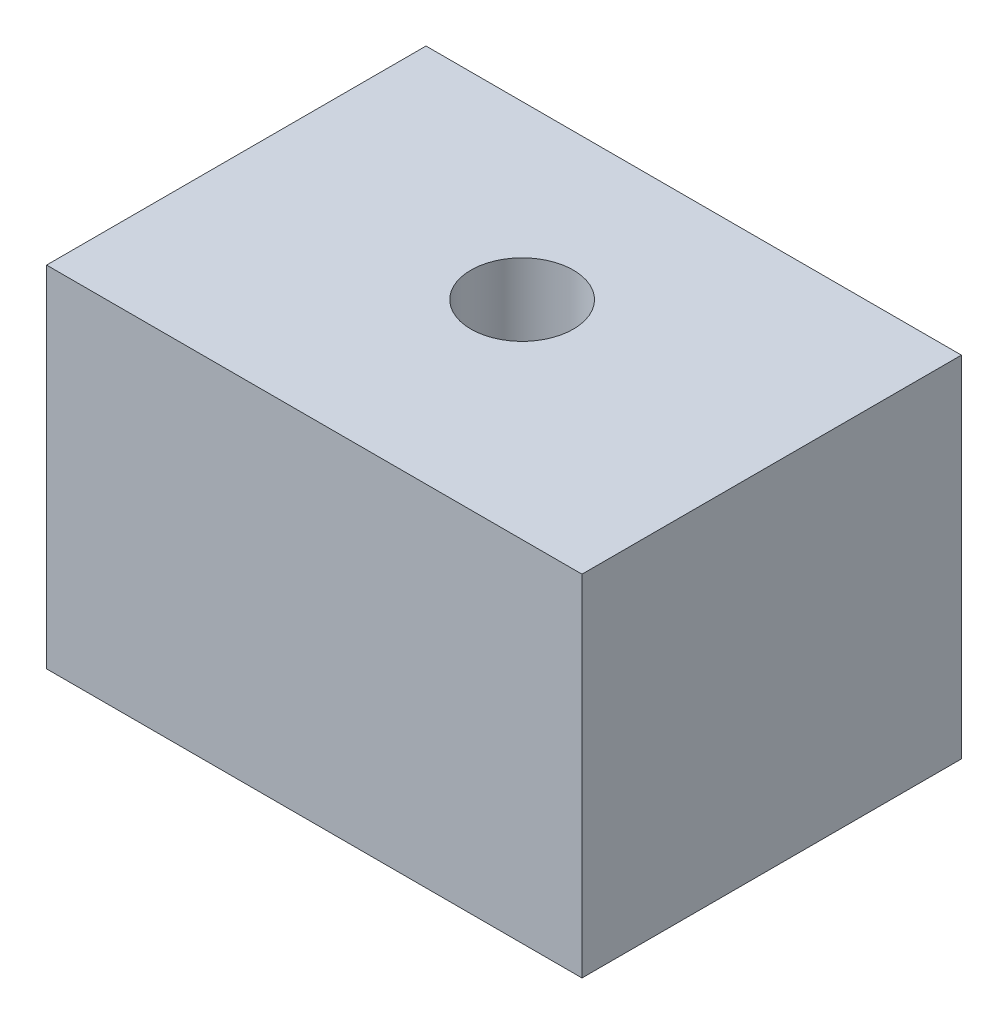
ISO-10303-21;
HEADER;
FILE_DESCRIPTION(('STEP AP214'),'2;1');
FILE_NAME('part.step','',(''),(''),'','','');
FILE_SCHEMA(('AUTOMOTIVE_DESIGN { 1 0 10303 214 1 1 1 1 }'));
ENDSEC;
DATA;
#1=APPLICATION_CONTEXT('core data for automotive mechanical design processes');
#2=APPLICATION_PROTOCOL_DEFINITION('international standard','automotive_design',2000,#1);
#3=PRODUCT_CONTEXT('',#1,'mechanical');
#4=PRODUCT('Part','Part','',(#3));
#5=PRODUCT_RELATED_PRODUCT_CATEGORY('part','',(#4));
#6=PRODUCT_DEFINITION_FORMATION('','',#4);
#7=PRODUCT_DEFINITION_CONTEXT('part definition',#1,'design');
#8=PRODUCT_DEFINITION('design','',#6,#7);
#9=PRODUCT_DEFINITION_SHAPE('','',#8);
#10=(LENGTH_UNIT() NAMED_UNIT(*) SI_UNIT(.MILLI.,.METRE.));
#11=(NAMED_UNIT(*) PLANE_ANGLE_UNIT() SI_UNIT($,.RADIAN.));
#12=(NAMED_UNIT(*) SI_UNIT($,.STERADIAN.) SOLID_ANGLE_UNIT());
#13=UNCERTAINTY_MEASURE_WITH_UNIT(LENGTH_MEASURE(1.E-05),#10,'distance_accuracy_value','');
#14=(GEOMETRIC_REPRESENTATION_CONTEXT(3) GLOBAL_UNCERTAINTY_ASSIGNED_CONTEXT((#13)) GLOBAL_UNIT_ASSIGNED_CONTEXT((#10,
#11,#12)) REPRESENTATION_CONTEXT('',''));
#15=CARTESIAN_POINT('',(0.,0.,0.));
#16=DIRECTION('',(0.,0.,1.));
#17=DIRECTION('',(1.,0.,0.));
#18=AXIS2_PLACEMENT_3D('',#15,#16,#17);
#19=CARTESIAN_POINT('',(35.2778331148973,23.0435502776513,50.));
#20=DIRECTION('',(-1.,0.,0.));
#21=DIRECTION('',(0.,0.,1.));
#22=AXIS2_PLACEMENT_3D('',#19,#20,#21);
#23=PLANE('',#22);
#24=DIRECTION('',(0.,1.,0.));
#25=VECTOR('',#24,1.);
#26=CARTESIAN_POINT('',(35.2778331148973,23.0435502776513,0.));
#27=LINE('',#26,#25);
#28=CARTESIAN_POINT('',(35.2778331148973,-23.0435502776513,0.));
#29=VERTEX_POINT('',#28);
#30=CARTESIAN_POINT('',(35.2778331148973,23.0435502776513,0.));
#31=VERTEX_POINT('',#30);
#32=EDGE_CURVE('E117',#29,#31,#27,.T.);
#33=ORIENTED_EDGE('',*,*,#32,.T.);
#34=DIRECTION('',(0.,0.,-1.));
#35=VECTOR('',#34,1.);
#36=CARTESIAN_POINT('',(35.2778331148973,23.0435502776513,50.));
#37=LINE('',#36,#35);
#38=CARTESIAN_POINT('',(35.2778331148973,23.0435502776513,50.));
#39=VERTEX_POINT('',#38);
#40=EDGE_CURVE('E12',#39,#31,#37,.T.);
#41=ORIENTED_EDGE('',*,*,#40,.F.);
#42=DIRECTION('',(0.,1.,0.));
#43=VECTOR('',#42,1.);
#44=CARTESIAN_POINT('',(35.2778331148973,23.0435502776513,50.));
#45=LINE('',#44,#43);
#46=CARTESIAN_POINT('',(35.2778331148973,-23.0435502776513,50.));
#47=VERTEX_POINT('',#46);
#48=EDGE_CURVE('E102',#47,#39,#45,.T.);
#49=ORIENTED_EDGE('',*,*,#48,.F.);
#50=DIRECTION('',(0.,0.,-1.));
#51=VECTOR('',#50,1.);
#52=CARTESIAN_POINT('',(35.2778331148973,-23.0435502776513,50.));
#53=LINE('',#52,#51);
#54=EDGE_CURVE('E115',#47,#29,#53,.T.);
#55=ORIENTED_EDGE('',*,*,#54,.T.);
#56=EDGE_LOOP('',(#33,#41,#49,#55));
#57=FACE_BOUND('',#56,.T.);
#58=ADVANCED_FACE('F52',(#57),#23,.F.);
#59=CARTESIAN_POINT('',(-35.2778331148973,23.0435502776513,50.));
#60=DIRECTION('',(0.,-1.,0.));
#61=DIRECTION('',(0.,0.,-1.));
#62=AXIS2_PLACEMENT_3D('',#59,#60,#61);
#63=PLANE('',#62);
#64=CARTESIAN_POINT('',(0.,23.0435502776513,22.6088207693146));
#65=DIRECTION('',(0.,1.,0.));
#66=DIRECTION('',(0.,0.,1.));
#67=AXIS2_PLACEMENT_3D('',#64,#65,#66);
#68=CIRCLE('',#67,6.746875);
#69=CARTESIAN_POINT('',(0.,23.0435502776513,29.3556957693146));
#70=VERTEX_POINT('',#69);
#71=EDGE_CURVE('E116',#70,#70,#68,.T.);
#72=ORIENTED_EDGE('',*,*,#71,.F.);
#73=EDGE_LOOP('',(#72));
#74=FACE_BOUND('',#73,.T.);
#75=DIRECTION('',(-1.,0.,0.));
#76=VECTOR('',#75,1.);
#77=CARTESIAN_POINT('',(-35.2778331148973,23.0435502776513,0.));
#78=LINE('',#77,#76);
#79=CARTESIAN_POINT('',(-35.2778331148973,23.0435502776513,0.));
#80=VERTEX_POINT('',#79);
#81=EDGE_CURVE('E107',#31,#80,#78,.T.);
#82=ORIENTED_EDGE('',*,*,#81,.T.);
#83=DIRECTION('',(0.,0.,-1.));
#84=VECTOR('',#83,1.);
#85=CARTESIAN_POINT('',(-35.2778331148973,23.0435502776513,50.));
#86=LINE('',#85,#84);
#87=CARTESIAN_POINT('',(-35.2778331148973,23.0435502776513,50.));
#88=VERTEX_POINT('',#87);
#89=EDGE_CURVE('E62',#88,#80,#86,.T.);
#90=ORIENTED_EDGE('',*,*,#89,.F.);
#91=DIRECTION('',(-1.,0.,0.));
#92=VECTOR('',#91,1.);
#93=CARTESIAN_POINT('',(-35.2778331148973,23.0435502776513,50.));
#94=LINE('',#93,#92);
#95=EDGE_CURVE('E97',#39,#88,#94,.T.);
#96=ORIENTED_EDGE('',*,*,#95,.F.);
#97=ORIENTED_EDGE('',*,*,#40,.T.);
#98=EDGE_LOOP('',(#82,#90,#96,#97));
#99=FACE_BOUND('',#98,.T.);
#100=ADVANCED_FACE('F110',(#74,#99),#63,.F.);
#101=CARTESIAN_POINT('',(-35.2778331148973,23.0435502776513,50.));
#102=DIRECTION('',(1.,0.,0.));
#103=DIRECTION('',(0.,0.,-1.));
#104=AXIS2_PLACEMENT_3D('',#101,#102,#103);
#105=PLANE('',#104);
#106=DIRECTION('',(0.,-1.,0.));
#107=VECTOR('',#106,1.);
#108=CARTESIAN_POINT('',(-35.2778331148973,23.0435502776513,0.));
#109=LINE('',#108,#107);
#110=CARTESIAN_POINT('',(-35.2778331148973,-23.0435502776513,0.));
#111=VERTEX_POINT('',#110);
#112=EDGE_CURVE('E88',#80,#111,#109,.T.);
#113=ORIENTED_EDGE('',*,*,#112,.T.);
#114=DIRECTION('',(0.,0.,-1.));
#115=VECTOR('',#114,1.);
#116=CARTESIAN_POINT('',(-35.2778331148973,-23.0435502776513,50.));
#117=LINE('',#116,#115);
#118=CARTESIAN_POINT('',(-35.2778331148973,-23.0435502776513,50.));
#119=VERTEX_POINT('',#118);
#120=EDGE_CURVE('E108',#119,#111,#117,.T.);
#121=ORIENTED_EDGE('',*,*,#120,.F.);
#122=DIRECTION('',(0.,-1.,0.));
#123=VECTOR('',#122,1.);
#124=CARTESIAN_POINT('',(-35.2778331148973,23.0435502776513,50.));
#125=LINE('',#124,#123);
#126=EDGE_CURVE('E105',#88,#119,#125,.T.);
#127=ORIENTED_EDGE('',*,*,#126,.F.);
#128=ORIENTED_EDGE('',*,*,#89,.T.);
#129=EDGE_LOOP('',(#113,#121,#127,#128));
#130=FACE_BOUND('',#129,.T.);
#131=ADVANCED_FACE('F109',(#130),#105,.F.);
#132=CARTESIAN_POINT('',(-35.2778331148973,-23.0435502776513,50.));
#133=DIRECTION('',(0.,1.,0.));
#134=DIRECTION('',(0.,0.,1.));
#135=AXIS2_PLACEMENT_3D('',#132,#133,#134);
#136=PLANE('',#135);
#137=CARTESIAN_POINT('',(0.,-23.0435502775777,22.6088207693146));
#138=DIRECTION('',(0.,1.,0.));
#139=DIRECTION('',(0.,0.,1.));
#140=AXIS2_PLACEMENT_3D('',#137,#138,#139);
#141=CIRCLE('',#140,2.5273);
#142=CARTESIAN_POINT('',(0.,-23.0435502775777,25.1361207693146));
#143=VERTEX_POINT('',#142);
#144=EDGE_CURVE('E145',#143,#143,#141,.T.);
#145=ORIENTED_EDGE('',*,*,#144,.T.);
#146=EDGE_LOOP('',(#145));
#147=FACE_BOUND('',#146,.T.);
#148=DIRECTION('',(1.,0.,0.));
#149=VECTOR('',#148,1.);
#150=CARTESIAN_POINT('',(-35.2778331148973,-23.0435502776513,0.));
#151=LINE('',#150,#149);
#152=EDGE_CURVE('E95',#111,#29,#151,.T.);
#153=ORIENTED_EDGE('',*,*,#152,.T.);
#154=ORIENTED_EDGE('',*,*,#54,.F.);
#155=DIRECTION('',(1.,0.,0.));
#156=VECTOR('',#155,1.);
#157=CARTESIAN_POINT('',(-35.2778331148973,-23.0435502776513,50.));
#158=LINE('',#157,#156);
#159=EDGE_CURVE('E69',#119,#47,#158,.T.);
#160=ORIENTED_EDGE('',*,*,#159,.F.);
#161=ORIENTED_EDGE('',*,*,#120,.T.);
#162=EDGE_LOOP('',(#153,#154,#160,#161));
#163=FACE_BOUND('',#162,.T.);
#164=ADVANCED_FACE('F124',(#147,#163),#136,.F.);
#165=CARTESIAN_POINT('',(0.,0.,50.));
#166=DIRECTION('',(0.,0.,1.));
#167=DIRECTION('',(1.,0.,0.));
#168=AXIS2_PLACEMENT_3D('',#165,#166,#167);
#169=PLANE('',#168);
#170=ORIENTED_EDGE('',*,*,#48,.T.);
#171=ORIENTED_EDGE('',*,*,#95,.T.);
#172=ORIENTED_EDGE('',*,*,#126,.T.);
#173=ORIENTED_EDGE('',*,*,#159,.T.);
#174=EDGE_LOOP('',(#170,#171,#172,#173));
#175=FACE_BOUND('',#174,.T.);
#176=ADVANCED_FACE('F99',(#175),#169,.T.);
#177=CARTESIAN_POINT('',(0.,0.,0.));
#178=DIRECTION('',(0.,0.,1.));
#179=DIRECTION('',(1.,0.,0.));
#180=AXIS2_PLACEMENT_3D('',#177,#178,#179);
#181=PLANE('',#180);
#182=ORIENTED_EDGE('',*,*,#32,.F.);
#183=ORIENTED_EDGE('',*,*,#152,.F.);
#184=ORIENTED_EDGE('',*,*,#112,.F.);
#185=ORIENTED_EDGE('',*,*,#81,.F.);
#186=EDGE_LOOP('',(#182,#183,#184,#185));
#187=FACE_BOUND('',#186,.T.);
#188=ADVANCED_FACE('F130',(#187),#181,.F.);
#189=CARTESIAN_POINT('',(0.,23.0435502776513,22.6088207693146));
#190=DIRECTION('',(0.,1.,0.));
#191=DIRECTION('',(0.,0.,1.));
#192=AXIS2_PLACEMENT_3D('',#189,#190,#191);
#193=CYLINDRICAL_SURFACE('',#192,6.746875);
#194=CARTESIAN_POINT('',(0.,11.6135502776513,22.6088207693146));
#195=DIRECTION('',(0.,1.,0.));
#196=DIRECTION('',(0.,0.,1.));
#197=AXIS2_PLACEMENT_3D('',#194,#195,#196);
#198=CIRCLE('',#197,6.746875);
#199=CARTESIAN_POINT('',(0.,11.6135502776513,29.3556957693146));
#200=VERTEX_POINT('',#199);
#201=EDGE_CURVE('E135',#200,#200,#198,.T.);
#202=ORIENTED_EDGE('',*,*,#201,.F.);
#203=EDGE_LOOP('',(#202));
#204=FACE_BOUND('',#203,.T.);
#205=ORIENTED_EDGE('',*,*,#71,.T.);
#206=EDGE_LOOP('',(#205));
#207=FACE_BOUND('',#206,.T.);
#208=ADVANCED_FACE('F168',(#204,#207),#193,.F.);
#209=CARTESIAN_POINT('',(6.746875,11.6135502776513,22.6088207693146));
#210=DIRECTION('',(0.,-1.,0.));
#211=DIRECTION('',(0.,0.,-1.));
#212=AXIS2_PLACEMENT_3D('',#209,#210,#211);
#213=PLANE('',#212);
#214=CARTESIAN_POINT('',(0.,11.6135502776513,22.6088207693146));
#215=DIRECTION('',(0.,1.,0.));
#216=DIRECTION('',(0.,0.,1.));
#217=AXIS2_PLACEMENT_3D('',#214,#215,#216);
#218=CIRCLE('',#217,3.570986);
#219=CARTESIAN_POINT('',(0.,11.6135502776513,26.1798067693145));
#220=VERTEX_POINT('',#219);
#221=EDGE_CURVE('E133',#220,#220,#218,.T.);
#222=ORIENTED_EDGE('',*,*,#221,.F.);
#223=EDGE_LOOP('',(#222));
#224=FACE_BOUND('',#223,.T.);
#225=ORIENTED_EDGE('',*,*,#201,.T.);
#226=EDGE_LOOP('',(#225));
#227=FACE_BOUND('',#226,.T.);
#228=ADVANCED_FACE('F163',(#224,#227),#213,.F.);
#229=CARTESIAN_POINT('',(0.,11.6135502776513,22.6088207693146));
#230=DIRECTION('',(0.,1.,0.));
#231=DIRECTION('',(0.,0.,1.));
#232=AXIS2_PLACEMENT_3D('',#229,#230,#231);
#233=CONICAL_SURFACE('',#232,3.570986,0.0312091050195366);
#234=CARTESIAN_POINT('',(0.,4.72761027765127,22.6088207693146));
#235=DIRECTION('',(0.,1.,0.));
#236=DIRECTION('',(0.,0.,1.));
#237=AXIS2_PLACEMENT_3D('',#234,#235,#236);
#238=CIRCLE('',#237,3.35601217542403);
#239=CARTESIAN_POINT('',(0.,4.72761027765127,25.9648329447386));
#240=VERTEX_POINT('',#239);
#241=EDGE_CURVE('E138',#240,#240,#238,.T.);
#242=ORIENTED_EDGE('',*,*,#241,.F.);
#243=EDGE_LOOP('',(#242));
#244=FACE_BOUND('',#243,.T.);
#245=ORIENTED_EDGE('',*,*,#221,.T.);
#246=EDGE_LOOP('',(#245));
#247=FACE_BOUND('',#246,.T.);
#248=ADVANCED_FACE('F158',(#244,#247),#233,.F.);
#249=CARTESIAN_POINT('',(3.35601217542403,4.72761027765127,22.6088207693146));
#250=DIRECTION('',(0.,-1.,0.));
#251=DIRECTION('',(0.,0.,-1.));
#252=AXIS2_PLACEMENT_3D('',#249,#250,#251);
#253=PLANE('',#252);
#254=CARTESIAN_POINT('',(0.,4.72761027765127,22.6088207693146));
#255=DIRECTION('',(0.,1.,0.));
#256=DIRECTION('',(0.,0.,1.));
#257=AXIS2_PLACEMENT_3D('',#254,#255,#256);
#258=CIRCLE('',#257,2.5273);
#259=CARTESIAN_POINT('',(0.,4.72761027765127,25.1361207693146));
#260=VERTEX_POINT('',#259);
#261=EDGE_CURVE('E143',#260,#260,#258,.T.);
#262=ORIENTED_EDGE('',*,*,#261,.F.);
#263=EDGE_LOOP('',(#262));
#264=FACE_BOUND('',#263,.T.);
#265=ORIENTED_EDGE('',*,*,#241,.T.);
#266=EDGE_LOOP('',(#265));
#267=FACE_BOUND('',#266,.T.);
#268=ADVANCED_FACE('F155',(#264,#267),#253,.F.);
#269=CARTESIAN_POINT('',(0.,23.0435502776513,22.6088207693146));
#270=DIRECTION('',(0.,1.,0.));
#271=DIRECTION('',(0.,0.,1.));
#272=AXIS2_PLACEMENT_3D('',#269,#270,#271);
#273=CYLINDRICAL_SURFACE('',#272,2.5273);
#274=ORIENTED_EDGE('',*,*,#144,.F.);
#275=EDGE_LOOP('',(#274));
#276=FACE_BOUND('',#275,.T.);
#277=ORIENTED_EDGE('',*,*,#261,.T.);
#278=EDGE_LOOP('',(#277));
#279=FACE_BOUND('',#278,.T.);
#280=ADVANCED_FACE('F149',(#276,#279),#273,.F.);
#281=CLOSED_SHELL('',(#58,#100,#131,#164,#176,#188,#208,#228,#248,#268,#280));
#282=MANIFOLD_SOLID_BREP('B2',#281);
#283=ADVANCED_BREP_SHAPE_REPRESENTATION('',(#18,#282),#14);
#284=SHAPE_DEFINITION_REPRESENTATION(#9,#283);
ENDSEC;
END-ISO-10303-21;
